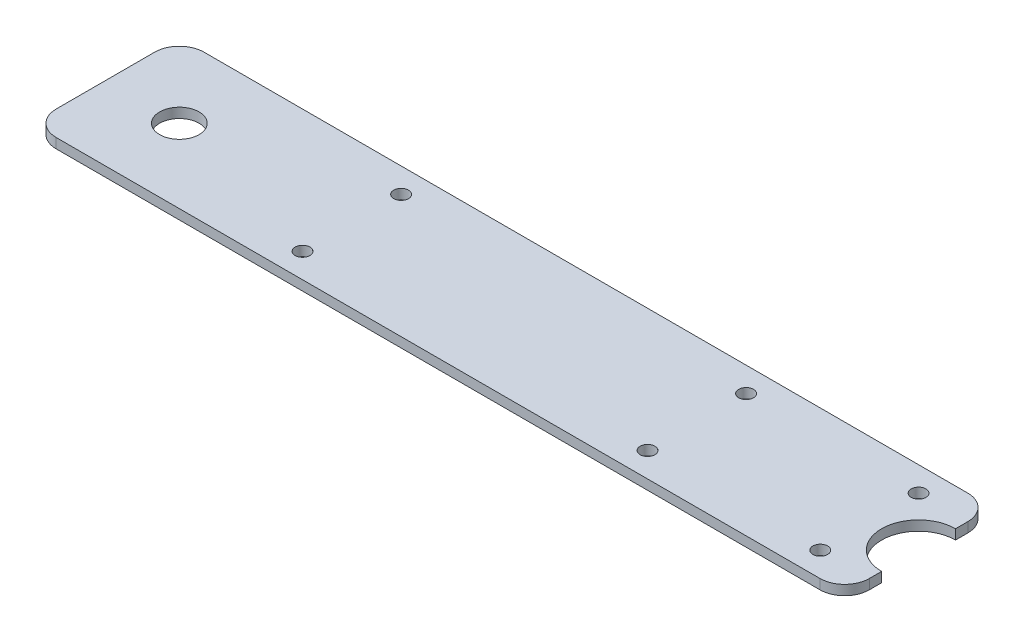
ISO-10303-21;
HEADER;
FILE_DESCRIPTION(('STEP AP214'),'2;1');
FILE_NAME('part.step','',(''),(''),'','','');
FILE_SCHEMA(('AUTOMOTIVE_DESIGN { 1 0 10303 214 1 1 1 1 }'));
ENDSEC;
DATA;
#1=APPLICATION_CONTEXT('core data for automotive mechanical design processes');
#2=APPLICATION_PROTOCOL_DEFINITION('international standard','automotive_design',2000,#1);
#3=PRODUCT_CONTEXT('',#1,'mechanical');
#4=PRODUCT('Part','Part','',(#3));
#5=PRODUCT_RELATED_PRODUCT_CATEGORY('part','',(#4));
#6=PRODUCT_DEFINITION_FORMATION('','',#4);
#7=PRODUCT_DEFINITION_CONTEXT('part definition',#1,'design');
#8=PRODUCT_DEFINITION('design','',#6,#7);
#9=PRODUCT_DEFINITION_SHAPE('','',#8);
#10=(LENGTH_UNIT() NAMED_UNIT(*) SI_UNIT(.MILLI.,.METRE.));
#11=(NAMED_UNIT(*) PLANE_ANGLE_UNIT() SI_UNIT($,.RADIAN.));
#12=(NAMED_UNIT(*) SI_UNIT($,.STERADIAN.) SOLID_ANGLE_UNIT());
#13=UNCERTAINTY_MEASURE_WITH_UNIT(LENGTH_MEASURE(1.E-05),#10,'distance_accuracy_value','');
#14=(GEOMETRIC_REPRESENTATION_CONTEXT(3) GLOBAL_UNCERTAINTY_ASSIGNED_CONTEXT((#13)) GLOBAL_UNIT_ASSIGNED_CONTEXT((#10,
#11,#12)) REPRESENTATION_CONTEXT('',''));
#15=CARTESIAN_POINT('',(0.,0.,0.));
#16=DIRECTION('',(0.,0.,1.));
#17=DIRECTION('',(1.,0.,0.));
#18=AXIS2_PLACEMENT_3D('',#15,#16,#17);
#19=CARTESIAN_POINT('',(82.5,2.,-15.));
#20=DIRECTION('',(-1.,0.,0.));
#21=DIRECTION('',(0.,0.,1.));
#22=AXIS2_PLACEMENT_3D('',#19,#20,#21);
#23=PLANE('',#22);
#24=DIRECTION('',(0.,0.,-1.));
#25=VECTOR('',#24,1.);
#26=CARTESIAN_POINT('',(82.5,0.,-15.));
#27=LINE('',#26,#25);
#28=CARTESIAN_POINT('',(82.5,0.,10.));
#29=VERTEX_POINT('',#28);
#30=CARTESIAN_POINT('',(82.5,0.,7.5));
#31=VERTEX_POINT('',#30);
#32=EDGE_CURVE('E128',#29,#31,#27,.T.);
#33=ORIENTED_EDGE('',*,*,#32,.T.);
#34=DIRECTION('',(0.,1.,0.));
#35=VECTOR('',#34,1.);
#36=CARTESIAN_POINT('',(82.5,-8.,7.5));
#37=LINE('',#36,#35);
#38=CARTESIAN_POINT('',(82.5,2.,7.5));
#39=VERTEX_POINT('',#38);
#40=EDGE_CURVE('E51',#31,#39,#37,.T.);
#41=ORIENTED_EDGE('',*,*,#40,.T.);
#42=DIRECTION('',(0.,0.,-1.));
#43=VECTOR('',#42,1.);
#44=CARTESIAN_POINT('',(82.5,2.,-15.));
#45=LINE('',#44,#43);
#46=CARTESIAN_POINT('',(82.5,2.,10.));
#47=VERTEX_POINT('',#46);
#48=EDGE_CURVE('E125',#47,#39,#45,.T.);
#49=ORIENTED_EDGE('',*,*,#48,.F.);
#50=DIRECTION('',(0.,-1.,0.));
#51=VECTOR('',#50,1.);
#52=CARTESIAN_POINT('',(82.5,2.,10.));
#53=LINE('',#52,#51);
#54=EDGE_CURVE('E161',#47,#29,#53,.T.);
#55=ORIENTED_EDGE('',*,*,#54,.T.);
#56=EDGE_LOOP('',(#33,#41,#49,#55));
#57=FACE_BOUND('',#56,.T.);
#58=ADVANCED_FACE('F34',(#57),#23,.F.);
#59=CARTESIAN_POINT('',(82.5,2.,-7.5));
#60=VERTEX_POINT('',#59);
#61=CARTESIAN_POINT('',(82.5,2.,-10.));
#62=VERTEX_POINT('',#61);
#63=EDGE_CURVE('E137',#60,#62,#45,.T.);
#64=ORIENTED_EDGE('',*,*,#63,.F.);
#65=DIRECTION('',(0.,1.,0.));
#66=VECTOR('',#65,1.);
#67=CARTESIAN_POINT('',(82.5,-8.,-7.5));
#68=LINE('',#67,#66);
#69=CARTESIAN_POINT('',(82.5,0.,-7.5));
#70=VERTEX_POINT('',#69);
#71=EDGE_CURVE('E115',#60,#70,#68,.F.);
#72=ORIENTED_EDGE('',*,*,#71,.T.);
#73=CARTESIAN_POINT('',(82.5,0.,-10.));
#74=VERTEX_POINT('',#73);
#75=EDGE_CURVE('E152',#70,#74,#27,.T.);
#76=ORIENTED_EDGE('',*,*,#75,.T.);
#77=DIRECTION('',(0.,-1.,0.));
#78=VECTOR('',#77,1.);
#79=CARTESIAN_POINT('',(82.5,2.,-10.));
#80=LINE('',#79,#78);
#81=EDGE_CURVE('E149',#74,#62,#80,.F.);
#82=ORIENTED_EDGE('',*,*,#81,.T.);
#83=EDGE_LOOP('',(#64,#72,#76,#82));
#84=FACE_BOUND('',#83,.T.);
#85=ADVANCED_FACE('F240',(#84),#23,.F.);
#86=CARTESIAN_POINT('',(-82.5,2.,-15.));
#87=DIRECTION('',(0.,0.,1.));
#88=DIRECTION('',(1.,0.,0.));
#89=AXIS2_PLACEMENT_3D('',#86,#87,#88);
#90=PLANE('',#89);
#91=DIRECTION('',(-1.,0.,0.));
#92=VECTOR('',#91,1.);
#93=CARTESIAN_POINT('',(-82.5,2.,-15.));
#94=LINE('',#93,#92);
#95=CARTESIAN_POINT('',(77.5,2.,-15.));
#96=VERTEX_POINT('',#95);
#97=CARTESIAN_POINT('',(-77.5,2.,-15.));
#98=VERTEX_POINT('',#97);
#99=EDGE_CURVE('E136',#96,#98,#94,.T.);
#100=ORIENTED_EDGE('',*,*,#99,.F.);
#101=DIRECTION('',(0.,-1.,0.));
#102=VECTOR('',#101,1.);
#103=CARTESIAN_POINT('',(77.5,2.,-15.));
#104=LINE('',#103,#102);
#105=CARTESIAN_POINT('',(77.5,0.,-15.));
#106=VERTEX_POINT('',#105);
#107=EDGE_CURVE('E186',#96,#106,#104,.T.);
#108=ORIENTED_EDGE('',*,*,#107,.T.);
#109=DIRECTION('',(-1.,0.,0.));
#110=VECTOR('',#109,1.);
#111=CARTESIAN_POINT('',(-82.5,0.,-15.));
#112=LINE('',#111,#110);
#113=CARTESIAN_POINT('',(-77.5,0.,-15.));
#114=VERTEX_POINT('',#113);
#115=EDGE_CURVE('E151',#106,#114,#112,.T.);
#116=ORIENTED_EDGE('',*,*,#115,.T.);
#117=DIRECTION('',(0.,-1.,0.));
#118=VECTOR('',#117,1.);
#119=CARTESIAN_POINT('',(-77.5,2.,-15.));
#120=LINE('',#119,#118);
#121=EDGE_CURVE('E184',#114,#98,#120,.F.);
#122=ORIENTED_EDGE('',*,*,#121,.T.);
#123=EDGE_LOOP('',(#100,#108,#116,#122));
#124=FACE_BOUND('',#123,.T.);
#125=ADVANCED_FACE('F245',(#124),#90,.F.);
#126=CARTESIAN_POINT('',(-82.5,2.,-15.));
#127=DIRECTION('',(1.,0.,0.));
#128=DIRECTION('',(0.,0.,-1.));
#129=AXIS2_PLACEMENT_3D('',#126,#127,#128);
#130=PLANE('',#129);
#131=DIRECTION('',(0.,0.,1.));
#132=VECTOR('',#131,1.);
#133=CARTESIAN_POINT('',(-82.5,2.,-15.));
#134=LINE('',#133,#132);
#135=CARTESIAN_POINT('',(-82.5,2.,-10.));
#136=VERTEX_POINT('',#135);
#137=CARTESIAN_POINT('',(-82.5,2.,10.));
#138=VERTEX_POINT('',#137);
#139=EDGE_CURVE('E140',#136,#138,#134,.T.);
#140=ORIENTED_EDGE('',*,*,#139,.F.);
#141=DIRECTION('',(0.,-1.,0.));
#142=VECTOR('',#141,1.);
#143=CARTESIAN_POINT('',(-82.5,2.,-10.));
#144=LINE('',#143,#142);
#145=CARTESIAN_POINT('',(-82.5,0.,-10.));
#146=VERTEX_POINT('',#145);
#147=EDGE_CURVE('E43',#136,#146,#144,.T.);
#148=ORIENTED_EDGE('',*,*,#147,.T.);
#149=DIRECTION('',(0.,0.,1.));
#150=VECTOR('',#149,1.);
#151=CARTESIAN_POINT('',(-82.5,0.,-15.));
#152=LINE('',#151,#150);
#153=CARTESIAN_POINT('',(-82.5,0.,10.));
#154=VERTEX_POINT('',#153);
#155=EDGE_CURVE('E155',#146,#154,#152,.T.);
#156=ORIENTED_EDGE('',*,*,#155,.T.);
#157=DIRECTION('',(0.,-1.,0.));
#158=VECTOR('',#157,1.);
#159=CARTESIAN_POINT('',(-82.5,2.,10.));
#160=LINE('',#159,#158);
#161=EDGE_CURVE('E58',#154,#138,#160,.F.);
#162=ORIENTED_EDGE('',*,*,#161,.T.);
#163=EDGE_LOOP('',(#140,#148,#156,#162));
#164=FACE_BOUND('',#163,.T.);
#165=ADVANCED_FACE('F233',(#164),#130,.F.);
#166=CARTESIAN_POINT('',(-82.5,2.,15.));
#167=DIRECTION('',(0.,0.,-1.));
#168=DIRECTION('',(-1.,0.,0.));
#169=AXIS2_PLACEMENT_3D('',#166,#167,#168);
#170=PLANE('',#169);
#171=DIRECTION('',(1.,0.,0.));
#172=VECTOR('',#171,1.);
#173=CARTESIAN_POINT('',(-82.5,0.,15.));
#174=LINE('',#173,#172);
#175=CARTESIAN_POINT('',(-77.5,0.,15.));
#176=VERTEX_POINT('',#175);
#177=CARTESIAN_POINT('',(77.5,0.,15.));
#178=VERTEX_POINT('',#177);
#179=EDGE_CURVE('E142',#176,#178,#174,.T.);
#180=ORIENTED_EDGE('',*,*,#179,.T.);
#181=DIRECTION('',(0.,-1.,0.));
#182=VECTOR('',#181,1.);
#183=CARTESIAN_POINT('',(77.5,2.,15.));
#184=LINE('',#183,#182);
#185=CARTESIAN_POINT('',(77.5,2.,15.));
#186=VERTEX_POINT('',#185);
#187=EDGE_CURVE('E175',#178,#186,#184,.F.);
#188=ORIENTED_EDGE('',*,*,#187,.T.);
#189=DIRECTION('',(1.,0.,0.));
#190=VECTOR('',#189,1.);
#191=CARTESIAN_POINT('',(-82.5,2.,15.));
#192=LINE('',#191,#190);
#193=CARTESIAN_POINT('',(-77.5,2.,15.));
#194=VERTEX_POINT('',#193);
#195=EDGE_CURVE('E147',#194,#186,#192,.T.);
#196=ORIENTED_EDGE('',*,*,#195,.F.);
#197=DIRECTION('',(0.,-1.,0.));
#198=VECTOR('',#197,1.);
#199=CARTESIAN_POINT('',(-77.5,2.,15.));
#200=LINE('',#199,#198);
#201=EDGE_CURVE('E172',#194,#176,#200,.T.);
#202=ORIENTED_EDGE('',*,*,#201,.T.);
#203=EDGE_LOOP('',(#180,#188,#196,#202));
#204=FACE_BOUND('',#203,.T.);
#205=ADVANCED_FACE('F223',(#204),#170,.F.);
#206=CARTESIAN_POINT('',(0.,2.,0.));
#207=DIRECTION('',(0.,1.,0.));
#208=DIRECTION('',(0.,0.,1.));
#209=AXIS2_PLACEMENT_3D('',#206,#207,#208);
#210=PLANE('',#209);
#211=CARTESIAN_POINT('',(72.5,2.,-10.));
#212=DIRECTION('',(0.,1.,0.));
#213=DIRECTION('',(0.,0.,1.));
#214=AXIS2_PLACEMENT_3D('',#211,#212,#213);
#215=CIRCLE('',#214,1.5);
#216=CARTESIAN_POINT('',(72.5,2.,-8.5));
#217=VERTEX_POINT('',#216);
#218=EDGE_CURVE('E417',#217,#217,#215,.T.);
#219=ORIENTED_EDGE('',*,*,#218,.F.);
#220=EDGE_LOOP('',(#219));
#221=FACE_BOUND('',#220,.T.);
#222=CARTESIAN_POINT('',(72.5558591060246,2.,10.));
#223=DIRECTION('',(0.,1.,0.));
#224=DIRECTION('',(0.,0.,1.));
#225=AXIS2_PLACEMENT_3D('',#222,#223,#224);
#226=CIRCLE('',#225,1.5);
#227=CARTESIAN_POINT('',(72.5558591060246,2.,11.5));
#228=VERTEX_POINT('',#227);
#229=EDGE_CURVE('E419',#228,#228,#226,.T.);
#230=ORIENTED_EDGE('',*,*,#229,.F.);
#231=EDGE_LOOP('',(#230));
#232=FACE_BOUND('',#231,.T.);
#233=CARTESIAN_POINT('',(37.5,2.,-10.));
#234=DIRECTION('',(0.,1.,0.));
#235=DIRECTION('',(0.,0.,1.));
#236=AXIS2_PLACEMENT_3D('',#233,#234,#235);
#237=CIRCLE('',#236,1.5);
#238=CARTESIAN_POINT('',(37.5,2.,-8.49999999999999));
#239=VERTEX_POINT('',#238);
#240=EDGE_CURVE('E198',#239,#239,#237,.T.);
#241=ORIENTED_EDGE('',*,*,#240,.F.);
#242=EDGE_LOOP('',(#241));
#243=FACE_BOUND('',#242,.T.);
#244=CARTESIAN_POINT('',(-32.5,2.,10.));
#245=DIRECTION('',(0.,1.,0.));
#246=DIRECTION('',(0.,0.,1.));
#247=AXIS2_PLACEMENT_3D('',#244,#245,#246);
#248=CIRCLE('',#247,1.5);
#249=CARTESIAN_POINT('',(-32.5,2.,11.5));
#250=VERTEX_POINT('',#249);
#251=EDGE_CURVE('E428',#250,#250,#248,.T.);
#252=ORIENTED_EDGE('',*,*,#251,.F.);
#253=EDGE_LOOP('',(#252));
#254=FACE_BOUND('',#253,.T.);
#255=CARTESIAN_POINT('',(37.5,2.,10.));
#256=DIRECTION('',(0.,1.,0.));
#257=DIRECTION('',(0.,0.,1.));
#258=AXIS2_PLACEMENT_3D('',#255,#256,#257);
#259=CIRCLE('',#258,1.5);
#260=CARTESIAN_POINT('',(37.5,2.,11.5));
#261=VERTEX_POINT('',#260);
#262=EDGE_CURVE('E210',#261,#261,#259,.T.);
#263=ORIENTED_EDGE('',*,*,#262,.F.);
#264=EDGE_LOOP('',(#263));
#265=FACE_BOUND('',#264,.T.);
#266=CARTESIAN_POINT('',(-32.5,2.,-10.));
#267=DIRECTION('',(0.,1.,0.));
#268=DIRECTION('',(0.,0.,1.));
#269=AXIS2_PLACEMENT_3D('',#266,#267,#268);
#270=CIRCLE('',#269,1.5);
#271=CARTESIAN_POINT('',(-32.5,2.,-8.49999999999999));
#272=VERTEX_POINT('',#271);
#273=EDGE_CURVE('E194',#272,#272,#270,.T.);
#274=ORIENTED_EDGE('',*,*,#273,.F.);
#275=EDGE_LOOP('',(#274));
#276=FACE_BOUND('',#275,.T.);
#277=CARTESIAN_POINT('',(82.5,2.,0.));
#278=DIRECTION('',(0.,1.,0.));
#279=DIRECTION('',(0.,0.,1.));
#280=AXIS2_PLACEMENT_3D('',#277,#278,#279);
#281=CIRCLE('',#280,7.5);
#282=EDGE_CURVE('E112',#60,#39,#281,.T.);
#283=ORIENTED_EDGE('',*,*,#282,.F.);
#284=ORIENTED_EDGE('',*,*,#63,.T.);
#285=CARTESIAN_POINT('',(77.5,2.,-10.));
#286=DIRECTION('',(0.,1.,0.));
#287=DIRECTION('',(0.,0.,1.));
#288=AXIS2_PLACEMENT_3D('',#285,#286,#287);
#289=CIRCLE('',#288,5.);
#290=EDGE_CURVE('E181',#62,#96,#289,.T.);
#291=ORIENTED_EDGE('',*,*,#290,.T.);
#292=ORIENTED_EDGE('',*,*,#99,.T.);
#293=CARTESIAN_POINT('',(-77.5,2.,-10.));
#294=DIRECTION('',(0.,1.,0.));
#295=DIRECTION('',(0.,0.,1.));
#296=AXIS2_PLACEMENT_3D('',#293,#294,#295);
#297=CIRCLE('',#296,5.);
#298=EDGE_CURVE('E179',#98,#136,#297,.T.);
#299=ORIENTED_EDGE('',*,*,#298,.T.);
#300=ORIENTED_EDGE('',*,*,#139,.T.);
#301=CARTESIAN_POINT('',(-77.5,2.,10.));
#302=DIRECTION('',(0.,1.,0.));
#303=DIRECTION('',(0.,0.,1.));
#304=AXIS2_PLACEMENT_3D('',#301,#302,#303);
#305=CIRCLE('',#304,5.);
#306=EDGE_CURVE('E177',#138,#194,#305,.T.);
#307=ORIENTED_EDGE('',*,*,#306,.T.);
#308=ORIENTED_EDGE('',*,*,#195,.T.);
#309=CARTESIAN_POINT('',(77.5,2.,10.));
#310=DIRECTION('',(0.,1.,0.));
#311=DIRECTION('',(0.,0.,1.));
#312=AXIS2_PLACEMENT_3D('',#309,#310,#311);
#313=CIRCLE('',#312,5.);
#314=EDGE_CURVE('E135',#186,#47,#313,.T.);
#315=ORIENTED_EDGE('',*,*,#314,.T.);
#316=ORIENTED_EDGE('',*,*,#48,.T.);
#317=EDGE_LOOP('',(#283,#284,#291,#292,#299,#300,#307,#308,#315,#316));
#318=FACE_BOUND('',#317,.T.);
#319=CARTESIAN_POINT('',(-67.5,2.,0.));
#320=DIRECTION('',(0.,1.,0.));
#321=DIRECTION('',(0.,0.,1.));
#322=AXIS2_PLACEMENT_3D('',#319,#320,#321);
#323=CIRCLE('',#322,4.00000000000001);
#324=CARTESIAN_POINT('',(-67.5,2.,4.00000000000001));
#325=VERTEX_POINT('',#324);
#326=EDGE_CURVE('E129',#325,#325,#323,.T.);
#327=ORIENTED_EDGE('',*,*,#326,.F.);
#328=EDGE_LOOP('',(#327));
#329=FACE_BOUND('',#328,.T.);
#330=ADVANCED_FACE('F131',(#221,#232,#243,#254,#265,#276,#318,#329),#210,.T.);
#331=CARTESIAN_POINT('',(0.,0.,0.));
#332=DIRECTION('',(0.,1.,0.));
#333=DIRECTION('',(0.,0.,1.));
#334=AXIS2_PLACEMENT_3D('',#331,#332,#333);
#335=PLANE('',#334);
#336=CARTESIAN_POINT('',(72.5,0.,-10.));
#337=DIRECTION('',(0.,1.,0.));
#338=DIRECTION('',(0.,0.,1.));
#339=AXIS2_PLACEMENT_3D('',#336,#337,#338);
#340=CIRCLE('',#339,1.5);
#341=CARTESIAN_POINT('',(72.5,0.,-8.5));
#342=VERTEX_POINT('',#341);
#343=EDGE_CURVE('E415',#342,#342,#340,.T.);
#344=ORIENTED_EDGE('',*,*,#343,.T.);
#345=EDGE_LOOP('',(#344));
#346=FACE_BOUND('',#345,.T.);
#347=CARTESIAN_POINT('',(72.5558591060246,0.,10.));
#348=DIRECTION('',(0.,1.,0.));
#349=DIRECTION('',(0.,0.,1.));
#350=AXIS2_PLACEMENT_3D('',#347,#348,#349);
#351=CIRCLE('',#350,1.5);
#352=CARTESIAN_POINT('',(72.5558591060246,0.,11.5));
#353=VERTEX_POINT('',#352);
#354=EDGE_CURVE('E422',#353,#353,#351,.T.);
#355=ORIENTED_EDGE('',*,*,#354,.T.);
#356=EDGE_LOOP('',(#355));
#357=FACE_BOUND('',#356,.T.);
#358=CARTESIAN_POINT('',(37.5,0.,-10.));
#359=DIRECTION('',(0.,1.,0.));
#360=DIRECTION('',(0.,0.,1.));
#361=AXIS2_PLACEMENT_3D('',#358,#359,#360);
#362=CIRCLE('',#361,1.5);
#363=CARTESIAN_POINT('',(37.5,0.,-8.49999999999999));
#364=VERTEX_POINT('',#363);
#365=EDGE_CURVE('E38',#364,#364,#362,.T.);
#366=ORIENTED_EDGE('',*,*,#365,.T.);
#367=EDGE_LOOP('',(#366));
#368=FACE_BOUND('',#367,.T.);
#369=CARTESIAN_POINT('',(-32.5,0.,10.));
#370=DIRECTION('',(0.,1.,0.));
#371=DIRECTION('',(0.,0.,1.));
#372=AXIS2_PLACEMENT_3D('',#369,#370,#371);
#373=CIRCLE('',#372,1.5);
#374=CARTESIAN_POINT('',(-32.5,0.,11.5));
#375=VERTEX_POINT('',#374);
#376=EDGE_CURVE('E197',#375,#375,#373,.T.);
#377=ORIENTED_EDGE('',*,*,#376,.T.);
#378=EDGE_LOOP('',(#377));
#379=FACE_BOUND('',#378,.T.);
#380=CARTESIAN_POINT('',(37.5,0.,10.));
#381=DIRECTION('',(0.,1.,0.));
#382=DIRECTION('',(0.,0.,1.));
#383=AXIS2_PLACEMENT_3D('',#380,#381,#382);
#384=CIRCLE('',#383,1.5);
#385=CARTESIAN_POINT('',(37.5,0.,11.5));
#386=VERTEX_POINT('',#385);
#387=EDGE_CURVE('E195',#386,#386,#384,.T.);
#388=ORIENTED_EDGE('',*,*,#387,.T.);
#389=EDGE_LOOP('',(#388));
#390=FACE_BOUND('',#389,.T.);
#391=CARTESIAN_POINT('',(-32.5,0.,-10.));
#392=DIRECTION('',(0.,1.,0.));
#393=DIRECTION('',(0.,0.,1.));
#394=AXIS2_PLACEMENT_3D('',#391,#392,#393);
#395=CIRCLE('',#394,1.5);
#396=CARTESIAN_POINT('',(-32.5,0.,-8.49999999999999));
#397=VERTEX_POINT('',#396);
#398=EDGE_CURVE('E119',#397,#397,#395,.T.);
#399=ORIENTED_EDGE('',*,*,#398,.T.);
#400=EDGE_LOOP('',(#399));
#401=FACE_BOUND('',#400,.T.);
#402=CARTESIAN_POINT('',(-67.5,0.,0.));
#403=DIRECTION('',(0.,1.,0.));
#404=DIRECTION('',(0.,0.,1.));
#405=AXIS2_PLACEMENT_3D('',#402,#403,#404);
#406=CIRCLE('',#405,4.00000000000001);
#407=CARTESIAN_POINT('',(-67.5,0.,4.00000000000001));
#408=VERTEX_POINT('',#407);
#409=EDGE_CURVE('E213',#408,#408,#406,.T.);
#410=ORIENTED_EDGE('',*,*,#409,.T.);
#411=EDGE_LOOP('',(#410));
#412=FACE_BOUND('',#411,.T.);
#413=ORIENTED_EDGE('',*,*,#75,.F.);
#414=CARTESIAN_POINT('',(82.5,0.,0.));
#415=DIRECTION('',(0.,1.,0.));
#416=DIRECTION('',(0.,0.,1.));
#417=AXIS2_PLACEMENT_3D('',#414,#415,#416);
#418=CIRCLE('',#417,7.5);
#419=EDGE_CURVE('E11',#70,#31,#418,.T.);
#420=ORIENTED_EDGE('',*,*,#419,.T.);
#421=ORIENTED_EDGE('',*,*,#32,.F.);
#422=CARTESIAN_POINT('',(77.5,0.,10.));
#423=DIRECTION('',(0.,1.,0.));
#424=DIRECTION('',(0.,0.,1.));
#425=AXIS2_PLACEMENT_3D('',#422,#423,#424);
#426=CIRCLE('',#425,5.);
#427=EDGE_CURVE('E170',#29,#178,#426,.F.);
#428=ORIENTED_EDGE('',*,*,#427,.T.);
#429=ORIENTED_EDGE('',*,*,#179,.F.);
#430=CARTESIAN_POINT('',(-77.5,0.,10.));
#431=DIRECTION('',(0.,1.,0.));
#432=DIRECTION('',(0.,0.,1.));
#433=AXIS2_PLACEMENT_3D('',#430,#431,#432);
#434=CIRCLE('',#433,5.);
#435=EDGE_CURVE('E163',#176,#154,#434,.F.);
#436=ORIENTED_EDGE('',*,*,#435,.T.);
#437=ORIENTED_EDGE('',*,*,#155,.F.);
#438=CARTESIAN_POINT('',(-77.5,0.,-10.));
#439=DIRECTION('',(0.,1.,0.));
#440=DIRECTION('',(0.,0.,1.));
#441=AXIS2_PLACEMENT_3D('',#438,#439,#440);
#442=CIRCLE('',#441,5.);
#443=EDGE_CURVE('E165',#146,#114,#442,.F.);
#444=ORIENTED_EDGE('',*,*,#443,.T.);
#445=ORIENTED_EDGE('',*,*,#115,.F.);
#446=CARTESIAN_POINT('',(77.5,0.,-10.));
#447=DIRECTION('',(0.,1.,0.));
#448=DIRECTION('',(0.,0.,1.));
#449=AXIS2_PLACEMENT_3D('',#446,#447,#448);
#450=CIRCLE('',#449,5.);
#451=EDGE_CURVE('E167',#106,#74,#450,.F.);
#452=ORIENTED_EDGE('',*,*,#451,.T.);
#453=EDGE_LOOP('',(#413,#420,#421,#428,#429,#436,#437,#444,#445,#452));
#454=FACE_BOUND('',#453,.T.);
#455=ADVANCED_FACE('F222',(#346,#357,#368,#379,#390,#401,#412,#454),#335,.F.);
#456=CARTESIAN_POINT('',(77.5,2.,10.));
#457=DIRECTION('',(0.,-1.,0.));
#458=DIRECTION('',(0.,0.,-1.));
#459=AXIS2_PLACEMENT_3D('',#456,#457,#458);
#460=CYLINDRICAL_SURFACE('',#459,5.);
#461=ORIENTED_EDGE('',*,*,#314,.F.);
#462=ORIENTED_EDGE('',*,*,#187,.F.);
#463=ORIENTED_EDGE('',*,*,#427,.F.);
#464=ORIENTED_EDGE('',*,*,#54,.F.);
#465=EDGE_LOOP('',(#461,#462,#463,#464));
#466=FACE_BOUND('',#465,.T.);
#467=ADVANCED_FACE('F230',(#466),#460,.T.);
#468=CARTESIAN_POINT('',(77.5,2.,-10.));
#469=DIRECTION('',(0.,-1.,0.));
#470=DIRECTION('',(0.,0.,-1.));
#471=AXIS2_PLACEMENT_3D('',#468,#469,#470);
#472=CYLINDRICAL_SURFACE('',#471,5.);
#473=ORIENTED_EDGE('',*,*,#290,.F.);
#474=ORIENTED_EDGE('',*,*,#81,.F.);
#475=ORIENTED_EDGE('',*,*,#451,.F.);
#476=ORIENTED_EDGE('',*,*,#107,.F.);
#477=EDGE_LOOP('',(#473,#474,#475,#476));
#478=FACE_BOUND('',#477,.T.);
#479=ADVANCED_FACE('F252',(#478),#472,.T.);
#480=CARTESIAN_POINT('',(-77.5,2.,-10.));
#481=DIRECTION('',(0.,-1.,0.));
#482=DIRECTION('',(0.,0.,-1.));
#483=AXIS2_PLACEMENT_3D('',#480,#481,#482);
#484=CYLINDRICAL_SURFACE('',#483,5.);
#485=ORIENTED_EDGE('',*,*,#298,.F.);
#486=ORIENTED_EDGE('',*,*,#121,.F.);
#487=ORIENTED_EDGE('',*,*,#443,.F.);
#488=ORIENTED_EDGE('',*,*,#147,.F.);
#489=EDGE_LOOP('',(#485,#486,#487,#488));
#490=FACE_BOUND('',#489,.T.);
#491=ADVANCED_FACE('F255',(#490),#484,.T.);
#492=CARTESIAN_POINT('',(-77.5,2.,10.));
#493=DIRECTION('',(0.,-1.,0.));
#494=DIRECTION('',(0.,0.,-1.));
#495=AXIS2_PLACEMENT_3D('',#492,#493,#494);
#496=CYLINDRICAL_SURFACE('',#495,5.);
#497=ORIENTED_EDGE('',*,*,#306,.F.);
#498=ORIENTED_EDGE('',*,*,#161,.F.);
#499=ORIENTED_EDGE('',*,*,#435,.F.);
#500=ORIENTED_EDGE('',*,*,#201,.F.);
#501=EDGE_LOOP('',(#497,#498,#499,#500));
#502=FACE_BOUND('',#501,.T.);
#503=ADVANCED_FACE('F36',(#502),#496,.T.);
#504=CARTESIAN_POINT('',(-67.5,0.,0.));
#505=DIRECTION('',(0.,1.,0.));
#506=DIRECTION('',(0.,0.,1.));
#507=AXIS2_PLACEMENT_3D('',#504,#505,#506);
#508=CYLINDRICAL_SURFACE('',#507,4.00000000000001);
#509=ORIENTED_EDGE('',*,*,#409,.F.);
#510=EDGE_LOOP('',(#509));
#511=FACE_BOUND('',#510,.T.);
#512=ORIENTED_EDGE('',*,*,#326,.T.);
#513=EDGE_LOOP('',(#512));
#514=FACE_BOUND('',#513,.T.);
#515=ADVANCED_FACE('F220',(#511,#514),#508,.F.);
#516=CARTESIAN_POINT('',(82.5,-8.,0.));
#517=DIRECTION('',(0.,1.,0.));
#518=DIRECTION('',(0.,0.,1.));
#519=AXIS2_PLACEMENT_3D('',#516,#517,#518);
#520=CYLINDRICAL_SURFACE('',#519,7.5);
#521=ORIENTED_EDGE('',*,*,#419,.F.);
#522=ORIENTED_EDGE('',*,*,#71,.F.);
#523=ORIENTED_EDGE('',*,*,#282,.T.);
#524=ORIENTED_EDGE('',*,*,#40,.F.);
#525=EDGE_LOOP('',(#521,#522,#523,#524));
#526=FACE_BOUND('',#525,.T.);
#527=ADVANCED_FACE('F113',(#526),#520,.F.);
#528=CARTESIAN_POINT('',(-32.5,-8.,-10.));
#529=DIRECTION('',(0.,1.,0.));
#530=DIRECTION('',(0.,0.,1.));
#531=AXIS2_PLACEMENT_3D('',#528,#529,#530);
#532=CYLINDRICAL_SURFACE('',#531,1.5);
#533=ORIENTED_EDGE('',*,*,#273,.T.);
#534=EDGE_LOOP('',(#533));
#535=FACE_BOUND('',#534,.T.);
#536=ORIENTED_EDGE('',*,*,#398,.F.);
#537=EDGE_LOOP('',(#536));
#538=FACE_BOUND('',#537,.T.);
#539=ADVANCED_FACE('F342',(#535,#538),#532,.F.);
#540=CARTESIAN_POINT('',(37.5,-8.,10.));
#541=DIRECTION('',(0.,1.,0.));
#542=DIRECTION('',(0.,0.,1.));
#543=AXIS2_PLACEMENT_3D('',#540,#541,#542);
#544=CYLINDRICAL_SURFACE('',#543,1.5);
#545=ORIENTED_EDGE('',*,*,#262,.T.);
#546=EDGE_LOOP('',(#545));
#547=FACE_BOUND('',#546,.T.);
#548=ORIENTED_EDGE('',*,*,#387,.F.);
#549=EDGE_LOOP('',(#548));
#550=FACE_BOUND('',#549,.T.);
#551=ADVANCED_FACE('F351',(#547,#550),#544,.F.);
#552=CARTESIAN_POINT('',(-32.5,-8.,10.));
#553=DIRECTION('',(0.,1.,0.));
#554=DIRECTION('',(0.,0.,1.));
#555=AXIS2_PLACEMENT_3D('',#552,#553,#554);
#556=CYLINDRICAL_SURFACE('',#555,1.5);
#557=ORIENTED_EDGE('',*,*,#251,.T.);
#558=EDGE_LOOP('',(#557));
#559=FACE_BOUND('',#558,.T.);
#560=ORIENTED_EDGE('',*,*,#376,.F.);
#561=EDGE_LOOP('',(#560));
#562=FACE_BOUND('',#561,.T.);
#563=ADVANCED_FACE('F360',(#559,#562),#556,.F.);
#564=CARTESIAN_POINT('',(37.5,-8.,-10.));
#565=DIRECTION('',(0.,1.,0.));
#566=DIRECTION('',(0.,0.,1.));
#567=AXIS2_PLACEMENT_3D('',#564,#565,#566);
#568=CYLINDRICAL_SURFACE('',#567,1.5);
#569=ORIENTED_EDGE('',*,*,#240,.T.);
#570=EDGE_LOOP('',(#569));
#571=FACE_BOUND('',#570,.T.);
#572=ORIENTED_EDGE('',*,*,#365,.F.);
#573=EDGE_LOOP('',(#572));
#574=FACE_BOUND('',#573,.T.);
#575=ADVANCED_FACE('F370',(#571,#574),#568,.F.);
#576=CARTESIAN_POINT('',(72.5558591060246,0.,10.));
#577=DIRECTION('',(0.,1.,0.));
#578=DIRECTION('',(0.,0.,1.));
#579=AXIS2_PLACEMENT_3D('',#576,#577,#578);
#580=CYLINDRICAL_SURFACE('',#579,1.5);
#581=ORIENTED_EDGE('',*,*,#354,.F.);
#582=EDGE_LOOP('',(#581));
#583=FACE_BOUND('',#582,.T.);
#584=ORIENTED_EDGE('',*,*,#229,.T.);
#585=EDGE_LOOP('',(#584));
#586=FACE_BOUND('',#585,.T.);
#587=ADVANCED_FACE('F379',(#583,#586),#580,.F.);
#588=CARTESIAN_POINT('',(72.5,0.,-10.));
#589=DIRECTION('',(0.,1.,0.));
#590=DIRECTION('',(0.,0.,1.));
#591=AXIS2_PLACEMENT_3D('',#588,#589,#590);
#592=CYLINDRICAL_SURFACE('',#591,1.5);
#593=ORIENTED_EDGE('',*,*,#343,.F.);
#594=EDGE_LOOP('',(#593));
#595=FACE_BOUND('',#594,.T.);
#596=ORIENTED_EDGE('',*,*,#218,.T.);
#597=EDGE_LOOP('',(#596));
#598=FACE_BOUND('',#597,.T.);
#599=ADVANCED_FACE('F398',(#595,#598),#592,.F.);
#600=CLOSED_SHELL('',(#58,#85,#125,#165,#205,#330,#455,#467,#479,#491,#503,#515,#527,#539,#551,
#563,#575,#587,#599));
#601=MANIFOLD_SOLID_BREP('B2',#600);
#602=ADVANCED_BREP_SHAPE_REPRESENTATION('',(#18,#601),#14);
#603=SHAPE_DEFINITION_REPRESENTATION(#9,#602);
ENDSEC;
END-ISO-10303-21;
